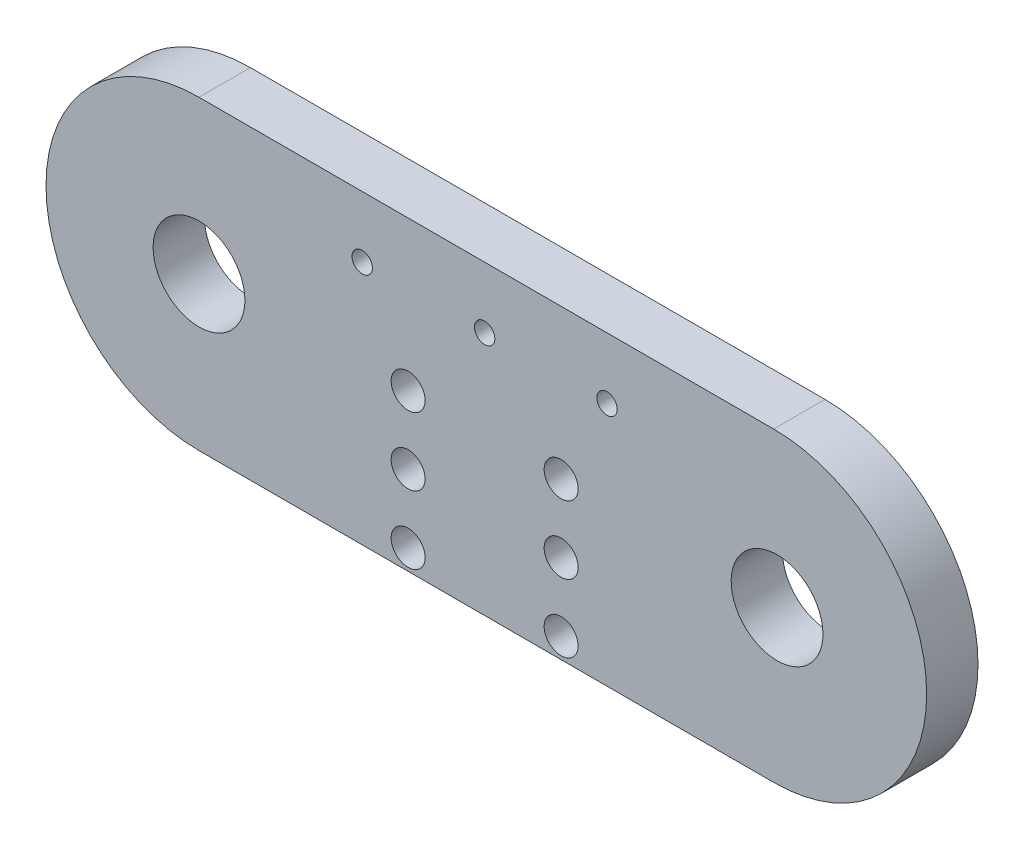
ISO-10303-21;
HEADER;
FILE_DESCRIPTION(('STEP AP214'),'2;1');
FILE_NAME('part.step','',(''),(''),'','','');
FILE_SCHEMA(('AUTOMOTIVE_DESIGN { 1 0 10303 214 1 1 1 1 }'));
ENDSEC;
DATA;
#1=APPLICATION_CONTEXT('core data for automotive mechanical design processes');
#2=APPLICATION_PROTOCOL_DEFINITION('international standard','automotive_design',2000,#1);
#3=PRODUCT_CONTEXT('',#1,'mechanical');
#4=PRODUCT('Part','Part','',(#3));
#5=PRODUCT_RELATED_PRODUCT_CATEGORY('part','',(#4));
#6=PRODUCT_DEFINITION_FORMATION('','',#4);
#7=PRODUCT_DEFINITION_CONTEXT('part definition',#1,'design');
#8=PRODUCT_DEFINITION('design','',#6,#7);
#9=PRODUCT_DEFINITION_SHAPE('','',#8);
#10=(LENGTH_UNIT() NAMED_UNIT(*) SI_UNIT(.MILLI.,.METRE.));
#11=(NAMED_UNIT(*) PLANE_ANGLE_UNIT() SI_UNIT($,.RADIAN.));
#12=(NAMED_UNIT(*) SI_UNIT($,.STERADIAN.) SOLID_ANGLE_UNIT());
#13=UNCERTAINTY_MEASURE_WITH_UNIT(LENGTH_MEASURE(1.E-05),#10,'distance_accuracy_value','');
#14=(GEOMETRIC_REPRESENTATION_CONTEXT(3) GLOBAL_UNCERTAINTY_ASSIGNED_CONTEXT((#13)) GLOBAL_UNIT_ASSIGNED_CONTEXT((#10,
#11,#12)) REPRESENTATION_CONTEXT('',''));
#15=CARTESIAN_POINT('',(0.,0.,0.));
#16=DIRECTION('',(0.,0.,1.));
#17=DIRECTION('',(1.,0.,0.));
#18=AXIS2_PLACEMENT_3D('',#15,#16,#17);
#19=CARTESIAN_POINT('',(48.5,61.,-0.046));
#20=DIRECTION('',(0.,0.,-1.));
#21=DIRECTION('',(0.,-1.,0.));
#22=AXIS2_PLACEMENT_3D('',#19,#20,#21);
#23=CYLINDRICAL_SURFACE('',#22,1.35);
#24=CARTESIAN_POINT('',(48.5,61.,0.));
#25=DIRECTION('',(0.,0.,-1.));
#26=DIRECTION('',(0.,-1.,0.));
#27=AXIS2_PLACEMENT_3D('',#24,#25,#26);
#28=CIRCLE('',#27,1.35);
#29=CARTESIAN_POINT('',(48.5,59.65,0.));
#30=VERTEX_POINT('',#29);
#31=EDGE_CURVE('E237',#30,#30,#28,.T.);
#32=ORIENTED_EDGE('',*,*,#31,.T.);
#33=DIRECTION('',(0.,0.,1.));
#34=VECTOR('',#33,1.);
#35=CARTESIAN_POINT('',(48.5,59.65,-0.046));
#36=LINE('',#35,#34);
#37=CARTESIAN_POINT('',(48.5,59.65,1.51));
#38=VERTEX_POINT('',#37);
#39=EDGE_CURVE('E11',#30,#38,#36,.T.);
#40=ORIENTED_EDGE('',*,*,#39,.T.);
#41=CARTESIAN_POINT('',(48.5,61.,1.51));
#42=DIRECTION('',(0.,0.,-1.));
#43=DIRECTION('',(0.,-1.,0.));
#44=AXIS2_PLACEMENT_3D('',#41,#42,#43);
#45=CIRCLE('',#44,1.35);
#46=EDGE_CURVE('E227',#38,#38,#45,.T.);
#47=ORIENTED_EDGE('',*,*,#46,.F.);
#48=ORIENTED_EDGE('',*,*,#39,.F.);
#49=EDGE_LOOP('',(#32,#40,#47,#48));
#50=FACE_BOUND('',#49,.T.);
#51=ADVANCED_FACE('F44',(#50),#23,.F.);
#52=CARTESIAN_POINT('',(43.5,63.7,-0.046));
#53=DIRECTION('',(0.,0.,-1.));
#54=DIRECTION('',(0.,-1.,0.));
#55=AXIS2_PLACEMENT_3D('',#52,#53,#54);
#56=CYLINDRICAL_SURFACE('',#55,0.3);
#57=CARTESIAN_POINT('',(43.5,63.7,0.));
#58=DIRECTION('',(0.,0.,-1.));
#59=DIRECTION('',(0.,-1.,0.));
#60=AXIS2_PLACEMENT_3D('',#57,#58,#59);
#61=CIRCLE('',#60,0.3);
#62=CARTESIAN_POINT('',(43.5,63.4,0.));
#63=VERTEX_POINT('',#62);
#64=EDGE_CURVE('E256',#63,#63,#61,.T.);
#65=ORIENTED_EDGE('',*,*,#64,.T.);
#66=DIRECTION('',(0.,0.,1.));
#67=VECTOR('',#66,1.);
#68=CARTESIAN_POINT('',(43.5,63.4,-0.046));
#69=LINE('',#68,#67);
#70=CARTESIAN_POINT('',(43.5,63.4,1.51));
#71=VERTEX_POINT('',#70);
#72=EDGE_CURVE('E54',#63,#71,#69,.T.);
#73=ORIENTED_EDGE('',*,*,#72,.T.);
#74=CARTESIAN_POINT('',(43.5,63.7,1.51));
#75=DIRECTION('',(0.,0.,-1.));
#76=DIRECTION('',(0.,-1.,0.));
#77=AXIS2_PLACEMENT_3D('',#74,#75,#76);
#78=CIRCLE('',#77,0.3);
#79=EDGE_CURVE('E202',#71,#71,#78,.T.);
#80=ORIENTED_EDGE('',*,*,#79,.F.);
#81=ORIENTED_EDGE('',*,*,#72,.F.);
#82=EDGE_LOOP('',(#65,#73,#80,#81));
#83=FACE_BOUND('',#82,.T.);
#84=ADVANCED_FACE('F311',(#83),#56,.F.);
#85=CARTESIAN_POINT('',(39.9,63.7,-0.046));
#86=DIRECTION('',(0.,0.,-1.));
#87=DIRECTION('',(0.,-1.,0.));
#88=AXIS2_PLACEMENT_3D('',#85,#86,#87);
#89=CYLINDRICAL_SURFACE('',#88,0.3);
#90=CARTESIAN_POINT('',(39.9,63.7,0.));
#91=DIRECTION('',(0.,0.,-1.));
#92=DIRECTION('',(0.,-1.,0.));
#93=AXIS2_PLACEMENT_3D('',#90,#91,#92);
#94=CIRCLE('',#93,0.3);
#95=CARTESIAN_POINT('',(39.9,63.4,0.));
#96=VERTEX_POINT('',#95);
#97=EDGE_CURVE('E259',#96,#96,#94,.T.);
#98=ORIENTED_EDGE('',*,*,#97,.T.);
#99=DIRECTION('',(0.,0.,1.));
#100=VECTOR('',#99,1.);
#101=CARTESIAN_POINT('',(39.9,63.4,-0.046));
#102=LINE('',#101,#100);
#103=CARTESIAN_POINT('',(39.9,63.4,1.51));
#104=VERTEX_POINT('',#103);
#105=EDGE_CURVE('E196',#96,#104,#102,.T.);
#106=ORIENTED_EDGE('',*,*,#105,.T.);
#107=CARTESIAN_POINT('',(39.9,63.7,1.51));
#108=DIRECTION('',(0.,0.,-1.));
#109=DIRECTION('',(0.,-1.,0.));
#110=AXIS2_PLACEMENT_3D('',#107,#108,#109);
#111=CIRCLE('',#110,0.3);
#112=EDGE_CURVE('E199',#104,#104,#111,.T.);
#113=ORIENTED_EDGE('',*,*,#112,.F.);
#114=ORIENTED_EDGE('',*,*,#105,.F.);
#115=EDGE_LOOP('',(#98,#106,#113,#114));
#116=FACE_BOUND('',#115,.T.);
#117=ADVANCED_FACE('F316',(#116),#89,.F.);
#118=CARTESIAN_POINT('',(42.15,61.1,-0.046));
#119=DIRECTION('',(0.,0.,-1.));
#120=DIRECTION('',(0.,-1.,0.));
#121=AXIS2_PLACEMENT_3D('',#118,#119,#120);
#122=CYLINDRICAL_SURFACE('',#121,0.5);
#123=CARTESIAN_POINT('',(42.15,61.1,0.));
#124=DIRECTION('',(0.,0.,-1.));
#125=DIRECTION('',(0.,-1.,0.));
#126=AXIS2_PLACEMENT_3D('',#123,#124,#125);
#127=CIRCLE('',#126,0.5);
#128=CARTESIAN_POINT('',(42.15,60.6,0.));
#129=VERTEX_POINT('',#128);
#130=EDGE_CURVE('E262',#129,#129,#127,.T.);
#131=ORIENTED_EDGE('',*,*,#130,.T.);
#132=DIRECTION('',(0.,0.,1.));
#133=VECTOR('',#132,1.);
#134=CARTESIAN_POINT('',(42.15,60.6,-0.046));
#135=LINE('',#134,#133);
#136=CARTESIAN_POINT('',(42.15,60.6,1.51));
#137=VERTEX_POINT('',#136);
#138=EDGE_CURVE('E207',#129,#137,#135,.T.);
#139=ORIENTED_EDGE('',*,*,#138,.T.);
#140=CARTESIAN_POINT('',(42.15,61.1,1.51));
#141=DIRECTION('',(0.,0.,-1.));
#142=DIRECTION('',(0.,-1.,0.));
#143=AXIS2_PLACEMENT_3D('',#140,#141,#142);
#144=CIRCLE('',#143,0.5);
#145=EDGE_CURVE('E203',#137,#137,#144,.T.);
#146=ORIENTED_EDGE('',*,*,#145,.F.);
#147=ORIENTED_EDGE('',*,*,#138,.F.);
#148=EDGE_LOOP('',(#131,#139,#146,#147));
#149=FACE_BOUND('',#148,.T.);
#150=ADVANCED_FACE('F388',(#149),#122,.F.);
#151=CARTESIAN_POINT('',(36.3,63.7,-0.046));
#152=DIRECTION('',(0.,0.,-1.));
#153=DIRECTION('',(0.,-1.,0.));
#154=AXIS2_PLACEMENT_3D('',#151,#152,#153);
#155=CYLINDRICAL_SURFACE('',#154,0.3);
#156=CARTESIAN_POINT('',(36.3,63.7,0.));
#157=DIRECTION('',(0.,0.,-1.));
#158=DIRECTION('',(0.,-1.,0.));
#159=AXIS2_PLACEMENT_3D('',#156,#157,#158);
#160=CIRCLE('',#159,0.3);
#161=CARTESIAN_POINT('',(36.3,63.4,0.));
#162=VERTEX_POINT('',#161);
#163=EDGE_CURVE('E252',#162,#162,#160,.T.);
#164=ORIENTED_EDGE('',*,*,#163,.T.);
#165=DIRECTION('',(0.,0.,1.));
#166=VECTOR('',#165,1.);
#167=CARTESIAN_POINT('',(36.3,63.4,-0.046));
#168=LINE('',#167,#166);
#169=CARTESIAN_POINT('',(36.3,63.4,1.51));
#170=VERTEX_POINT('',#169);
#171=EDGE_CURVE('E198',#162,#170,#168,.T.);
#172=ORIENTED_EDGE('',*,*,#171,.T.);
#173=CARTESIAN_POINT('',(36.3,63.7,1.51));
#174=DIRECTION('',(0.,0.,-1.));
#175=DIRECTION('',(0.,-1.,0.));
#176=AXIS2_PLACEMENT_3D('',#173,#174,#175);
#177=CIRCLE('',#176,0.3);
#178=EDGE_CURVE('E217',#170,#170,#177,.T.);
#179=ORIENTED_EDGE('',*,*,#178,.F.);
#180=ORIENTED_EDGE('',*,*,#171,.F.);
#181=EDGE_LOOP('',(#164,#172,#179,#180));
#182=FACE_BOUND('',#181,.T.);
#183=ADVANCED_FACE('F381',(#182),#155,.F.);
#184=CARTESIAN_POINT('',(37.65,61.1,-0.046));
#185=DIRECTION('',(0.,0.,-1.));
#186=DIRECTION('',(0.,-1.,0.));
#187=AXIS2_PLACEMENT_3D('',#184,#185,#186);
#188=CYLINDRICAL_SURFACE('',#187,0.5);
#189=CARTESIAN_POINT('',(37.65,61.1,0.));
#190=DIRECTION('',(0.,0.,-1.));
#191=DIRECTION('',(0.,-1.,0.));
#192=AXIS2_PLACEMENT_3D('',#189,#190,#191);
#193=CIRCLE('',#192,0.5);
#194=CARTESIAN_POINT('',(37.65,60.6,0.));
#195=VERTEX_POINT('',#194);
#196=EDGE_CURVE('E210',#195,#195,#193,.T.);
#197=ORIENTED_EDGE('',*,*,#196,.T.);
#198=DIRECTION('',(0.,0.,1.));
#199=VECTOR('',#198,1.);
#200=CARTESIAN_POINT('',(37.65,60.6,-0.046));
#201=LINE('',#200,#199);
#202=CARTESIAN_POINT('',(37.65,60.6,1.51));
#203=VERTEX_POINT('',#202);
#204=EDGE_CURVE('E147',#195,#203,#201,.T.);
#205=ORIENTED_EDGE('',*,*,#204,.T.);
#206=CARTESIAN_POINT('',(37.65,61.1,1.51));
#207=DIRECTION('',(0.,0.,-1.));
#208=DIRECTION('',(0.,-1.,0.));
#209=AXIS2_PLACEMENT_3D('',#206,#207,#208);
#210=CIRCLE('',#209,0.5);
#211=EDGE_CURVE('E187',#203,#203,#210,.T.);
#212=ORIENTED_EDGE('',*,*,#211,.F.);
#213=ORIENTED_EDGE('',*,*,#204,.F.);
#214=EDGE_LOOP('',(#197,#205,#212,#213));
#215=FACE_BOUND('',#214,.T.);
#216=ADVANCED_FACE('F346',(#215),#188,.F.);
#217=CARTESIAN_POINT('',(42.15,59.1,-0.046));
#218=DIRECTION('',(0.,0.,-1.));
#219=DIRECTION('',(0.,-1.,0.));
#220=AXIS2_PLACEMENT_3D('',#217,#218,#219);
#221=CYLINDRICAL_SURFACE('',#220,0.5);
#222=CARTESIAN_POINT('',(42.15,59.1,0.));
#223=DIRECTION('',(0.,0.,-1.));
#224=DIRECTION('',(0.,-1.,0.));
#225=AXIS2_PLACEMENT_3D('',#222,#223,#224);
#226=CIRCLE('',#225,0.5);
#227=CARTESIAN_POINT('',(42.15,58.6,0.));
#228=VERTEX_POINT('',#227);
#229=EDGE_CURVE('E205',#228,#228,#226,.T.);
#230=ORIENTED_EDGE('',*,*,#229,.T.);
#231=DIRECTION('',(0.,0.,1.));
#232=VECTOR('',#231,1.);
#233=CARTESIAN_POINT('',(42.15,58.6,-0.046));
#234=LINE('',#233,#232);
#235=CARTESIAN_POINT('',(42.15,58.6,1.51));
#236=VERTEX_POINT('',#235);
#237=EDGE_CURVE('E157',#228,#236,#234,.T.);
#238=ORIENTED_EDGE('',*,*,#237,.T.);
#239=CARTESIAN_POINT('',(42.15,59.1,1.51));
#240=DIRECTION('',(0.,0.,-1.));
#241=DIRECTION('',(0.,-1.,0.));
#242=AXIS2_PLACEMENT_3D('',#239,#240,#241);
#243=CIRCLE('',#242,0.5);
#244=EDGE_CURVE('E224',#236,#236,#243,.T.);
#245=ORIENTED_EDGE('',*,*,#244,.F.);
#246=ORIENTED_EDGE('',*,*,#237,.F.);
#247=EDGE_LOOP('',(#230,#238,#245,#246));
#248=FACE_BOUND('',#247,.T.);
#249=ADVANCED_FACE('F343',(#248),#221,.F.);
#250=CARTESIAN_POINT('',(37.65,59.1,-0.046));
#251=DIRECTION('',(0.,0.,-1.));
#252=DIRECTION('',(0.,-1.,0.));
#253=AXIS2_PLACEMENT_3D('',#250,#251,#252);
#254=CYLINDRICAL_SURFACE('',#253,0.5);
#255=CARTESIAN_POINT('',(37.65,59.1,0.));
#256=DIRECTION('',(0.,0.,-1.));
#257=DIRECTION('',(0.,-1.,0.));
#258=AXIS2_PLACEMENT_3D('',#255,#256,#257);
#259=CIRCLE('',#258,0.5);
#260=CARTESIAN_POINT('',(37.65,58.6,0.));
#261=VERTEX_POINT('',#260);
#262=EDGE_CURVE('E178',#261,#261,#259,.T.);
#263=ORIENTED_EDGE('',*,*,#262,.T.);
#264=DIRECTION('',(0.,0.,1.));
#265=VECTOR('',#264,1.);
#266=CARTESIAN_POINT('',(37.65,58.6,-0.046));
#267=LINE('',#266,#265);
#268=CARTESIAN_POINT('',(37.65,58.6,1.51));
#269=VERTEX_POINT('',#268);
#270=EDGE_CURVE('E175',#261,#269,#267,.T.);
#271=ORIENTED_EDGE('',*,*,#270,.T.);
#272=CARTESIAN_POINT('',(37.65,59.1,1.51));
#273=DIRECTION('',(0.,0.,-1.));
#274=DIRECTION('',(0.,-1.,0.));
#275=AXIS2_PLACEMENT_3D('',#272,#273,#274);
#276=CIRCLE('',#275,0.5);
#277=EDGE_CURVE('E180',#269,#269,#276,.T.);
#278=ORIENTED_EDGE('',*,*,#277,.F.);
#279=ORIENTED_EDGE('',*,*,#270,.F.);
#280=EDGE_LOOP('',(#263,#271,#278,#279));
#281=FACE_BOUND('',#280,.T.);
#282=ADVANCED_FACE('F176',(#281),#254,.F.);
#283=CARTESIAN_POINT('',(31.5,61.,-0.046));
#284=DIRECTION('',(0.,0.,-1.));
#285=DIRECTION('',(0.,-1.,0.));
#286=AXIS2_PLACEMENT_3D('',#283,#284,#285);
#287=CYLINDRICAL_SURFACE('',#286,1.35);
#288=CARTESIAN_POINT('',(31.5,61.,0.));
#289=DIRECTION('',(0.,0.,-1.));
#290=DIRECTION('',(0.,-1.,0.));
#291=AXIS2_PLACEMENT_3D('',#288,#289,#290);
#292=CIRCLE('',#291,1.35);
#293=CARTESIAN_POINT('',(31.5,59.65,0.));
#294=VERTEX_POINT('',#293);
#295=EDGE_CURVE('E206',#294,#294,#292,.T.);
#296=ORIENTED_EDGE('',*,*,#295,.T.);
#297=DIRECTION('',(0.,0.,1.));
#298=VECTOR('',#297,1.);
#299=CARTESIAN_POINT('',(31.5,59.65,-0.046));
#300=LINE('',#299,#298);
#301=CARTESIAN_POINT('',(31.5,59.65,1.51));
#302=VERTEX_POINT('',#301);
#303=EDGE_CURVE('E181',#294,#302,#300,.T.);
#304=ORIENTED_EDGE('',*,*,#303,.T.);
#305=CARTESIAN_POINT('',(31.5,61.,1.51));
#306=DIRECTION('',(0.,0.,-1.));
#307=DIRECTION('',(0.,-1.,0.));
#308=AXIS2_PLACEMENT_3D('',#305,#306,#307);
#309=CIRCLE('',#308,1.35);
#310=EDGE_CURVE('E225',#302,#302,#309,.T.);
#311=ORIENTED_EDGE('',*,*,#310,.F.);
#312=ORIENTED_EDGE('',*,*,#303,.F.);
#313=EDGE_LOOP('',(#296,#304,#311,#312));
#314=FACE_BOUND('',#313,.T.);
#315=ADVANCED_FACE('F279',(#314),#287,.F.);
#316=CARTESIAN_POINT('',(42.15,57.1,-0.046));
#317=DIRECTION('',(0.,0.,-1.));
#318=DIRECTION('',(0.,-1.,0.));
#319=AXIS2_PLACEMENT_3D('',#316,#317,#318);
#320=CYLINDRICAL_SURFACE('',#319,0.5);
#321=CARTESIAN_POINT('',(42.15,57.1,0.));
#322=DIRECTION('',(0.,0.,-1.));
#323=DIRECTION('',(0.,-1.,0.));
#324=AXIS2_PLACEMENT_3D('',#321,#322,#323);
#325=CIRCLE('',#324,0.5);
#326=CARTESIAN_POINT('',(42.15,56.6,0.));
#327=VERTEX_POINT('',#326);
#328=EDGE_CURVE('E213',#327,#327,#325,.T.);
#329=ORIENTED_EDGE('',*,*,#328,.T.);
#330=DIRECTION('',(0.,0.,1.));
#331=VECTOR('',#330,1.);
#332=CARTESIAN_POINT('',(42.15,56.6,-0.046));
#333=LINE('',#332,#331);
#334=CARTESIAN_POINT('',(42.15,56.6,1.51));
#335=VERTEX_POINT('',#334);
#336=EDGE_CURVE('E136',#327,#335,#333,.T.);
#337=ORIENTED_EDGE('',*,*,#336,.T.);
#338=CARTESIAN_POINT('',(42.15,57.1,1.51));
#339=DIRECTION('',(0.,0.,-1.));
#340=DIRECTION('',(0.,-1.,0.));
#341=AXIS2_PLACEMENT_3D('',#338,#339,#340);
#342=CIRCLE('',#341,0.5);
#343=EDGE_CURVE('E231',#335,#335,#342,.T.);
#344=ORIENTED_EDGE('',*,*,#343,.F.);
#345=ORIENTED_EDGE('',*,*,#336,.F.);
#346=EDGE_LOOP('',(#329,#337,#344,#345));
#347=FACE_BOUND('',#346,.T.);
#348=ADVANCED_FACE('F307',(#347),#320,.F.);
#349=CARTESIAN_POINT('',(37.65,57.1,-0.046));
#350=DIRECTION('',(0.,0.,-1.));
#351=DIRECTION('',(0.,-1.,0.));
#352=AXIS2_PLACEMENT_3D('',#349,#350,#351);
#353=CYLINDRICAL_SURFACE('',#352,0.5);
#354=CARTESIAN_POINT('',(37.65,57.1,0.));
#355=DIRECTION('',(0.,0.,-1.));
#356=DIRECTION('',(0.,-1.,0.));
#357=AXIS2_PLACEMENT_3D('',#354,#355,#356);
#358=CIRCLE('',#357,0.5);
#359=CARTESIAN_POINT('',(37.65,56.6,0.));
#360=VERTEX_POINT('',#359);
#361=EDGE_CURVE('E211',#360,#360,#358,.T.);
#362=ORIENTED_EDGE('',*,*,#361,.T.);
#363=DIRECTION('',(0.,0.,1.));
#364=VECTOR('',#363,1.);
#365=CARTESIAN_POINT('',(37.65,56.6,-0.046));
#366=LINE('',#365,#364);
#367=CARTESIAN_POINT('',(37.65,56.6,1.51));
#368=VERTEX_POINT('',#367);
#369=EDGE_CURVE('E129',#360,#368,#366,.T.);
#370=ORIENTED_EDGE('',*,*,#369,.T.);
#371=CARTESIAN_POINT('',(37.65,57.1,1.51));
#372=DIRECTION('',(0.,0.,-1.));
#373=DIRECTION('',(0.,-1.,0.));
#374=AXIS2_PLACEMENT_3D('',#371,#372,#373);
#375=CIRCLE('',#374,0.5);
#376=EDGE_CURVE('E191',#368,#368,#375,.T.);
#377=ORIENTED_EDGE('',*,*,#376,.F.);
#378=ORIENTED_EDGE('',*,*,#369,.F.);
#379=EDGE_LOOP('',(#362,#370,#377,#378));
#380=FACE_BOUND('',#379,.T.);
#381=ADVANCED_FACE('F300',(#380),#353,.F.);
#382=CARTESIAN_POINT('',(31.5,61.,0.));
#383=DIRECTION('',(0.,0.,-1.));
#384=DIRECTION('',(0.,-1.,0.));
#385=AXIS2_PLACEMENT_3D('',#382,#383,#384);
#386=CYLINDRICAL_SURFACE('',#385,4.5);
#387=DIRECTION('',(0.,0.,1.));
#388=VECTOR('',#387,1.);
#389=CARTESIAN_POINT('',(31.5,56.5,0.));
#390=LINE('',#389,#388);
#391=CARTESIAN_POINT('',(31.5,56.5,0.));
#392=VERTEX_POINT('',#391);
#393=CARTESIAN_POINT('',(31.5,56.5,1.51));
#394=VERTEX_POINT('',#393);
#395=EDGE_CURVE('E194',#392,#394,#390,.T.);
#396=ORIENTED_EDGE('',*,*,#395,.T.);
#397=CARTESIAN_POINT('',(31.5,61.,1.51));
#398=DIRECTION('',(0.,0.,-1.));
#399=DIRECTION('',(0.,-1.,0.));
#400=AXIS2_PLACEMENT_3D('',#397,#398,#399);
#401=CIRCLE('',#400,4.5);
#402=CARTESIAN_POINT('',(31.5,65.5,1.51));
#403=VERTEX_POINT('',#402);
#404=EDGE_CURVE('E189',#394,#403,#401,.T.);
#405=ORIENTED_EDGE('',*,*,#404,.T.);
#406=DIRECTION('',(0.,0.,1.));
#407=VECTOR('',#406,1.);
#408=CARTESIAN_POINT('',(31.5,65.5,0.));
#409=LINE('',#408,#407);
#410=CARTESIAN_POINT('',(31.5,65.5,0.));
#411=VERTEX_POINT('',#410);
#412=EDGE_CURVE('E121',#411,#403,#409,.T.);
#413=ORIENTED_EDGE('',*,*,#412,.F.);
#414=CARTESIAN_POINT('',(31.5,61.,0.));
#415=DIRECTION('',(0.,0.,-1.));
#416=DIRECTION('',(0.,-1.,0.));
#417=AXIS2_PLACEMENT_3D('',#414,#415,#416);
#418=CIRCLE('',#417,4.5);
#419=EDGE_CURVE('E241',#392,#411,#418,.T.);
#420=ORIENTED_EDGE('',*,*,#419,.F.);
#421=EDGE_LOOP('',(#396,#405,#413,#420));
#422=FACE_BOUND('',#421,.T.);
#423=ADVANCED_FACE('F297',(#422),#386,.T.);
#424=CARTESIAN_POINT('',(31.5,65.5,0.));
#425=DIRECTION('',(0.,1.,0.));
#426=DIRECTION('',(1.,0.,0.));
#427=AXIS2_PLACEMENT_3D('',#424,#425,#426);
#428=PLANE('',#427);
#429=ORIENTED_EDGE('',*,*,#412,.T.);
#430=DIRECTION('',(1.,0.,0.));
#431=VECTOR('',#430,1.);
#432=CARTESIAN_POINT('',(31.5,65.5,1.51));
#433=LINE('',#432,#431);
#434=CARTESIAN_POINT('',(48.4,65.5,1.51));
#435=VERTEX_POINT('',#434);
#436=EDGE_CURVE('E192',#403,#435,#433,.T.);
#437=ORIENTED_EDGE('',*,*,#436,.T.);
#438=DIRECTION('',(0.,0.,1.));
#439=VECTOR('',#438,1.);
#440=CARTESIAN_POINT('',(48.4,65.5,0.));
#441=LINE('',#440,#439);
#442=CARTESIAN_POINT('',(48.4,65.5,0.));
#443=VERTEX_POINT('',#442);
#444=EDGE_CURVE('E112',#443,#435,#441,.T.);
#445=ORIENTED_EDGE('',*,*,#444,.F.);
#446=DIRECTION('',(1.,0.,0.));
#447=VECTOR('',#446,1.);
#448=CARTESIAN_POINT('',(31.5,65.5,0.));
#449=LINE('',#448,#447);
#450=EDGE_CURVE('E220',#411,#443,#449,.T.);
#451=ORIENTED_EDGE('',*,*,#450,.F.);
#452=EDGE_LOOP('',(#429,#437,#445,#451));
#453=FACE_BOUND('',#452,.T.);
#454=ADVANCED_FACE('F299',(#453),#428,.T.);
#455=CARTESIAN_POINT('',(48.4,61.,0.));
#456=DIRECTION('',(0.,0.,-1.));
#457=DIRECTION('',(0.,1.,0.));
#458=AXIS2_PLACEMENT_3D('',#455,#456,#457);
#459=CYLINDRICAL_SURFACE('',#458,4.5);
#460=ORIENTED_EDGE('',*,*,#444,.T.);
#461=CARTESIAN_POINT('',(48.4,61.,1.51));
#462=DIRECTION('',(0.,0.,-1.));
#463=DIRECTION('',(0.,1.,0.));
#464=AXIS2_PLACEMENT_3D('',#461,#462,#463);
#465=CIRCLE('',#464,4.5);
#466=CARTESIAN_POINT('',(48.4,56.5,1.51));
#467=VERTEX_POINT('',#466);
#468=EDGE_CURVE('E236',#435,#467,#465,.T.);
#469=ORIENTED_EDGE('',*,*,#468,.T.);
#470=DIRECTION('',(0.,0.,1.));
#471=VECTOR('',#470,1.);
#472=CARTESIAN_POINT('',(48.4,56.5,0.));
#473=LINE('',#472,#471);
#474=CARTESIAN_POINT('',(48.4,56.5,0.));
#475=VERTEX_POINT('',#474);
#476=EDGE_CURVE('E228',#475,#467,#473,.T.);
#477=ORIENTED_EDGE('',*,*,#476,.F.);
#478=CARTESIAN_POINT('',(48.4,61.,0.));
#479=DIRECTION('',(0.,0.,-1.));
#480=DIRECTION('',(0.,1.,0.));
#481=AXIS2_PLACEMENT_3D('',#478,#479,#480);
#482=CIRCLE('',#481,4.5);
#483=EDGE_CURVE('E214',#443,#475,#482,.T.);
#484=ORIENTED_EDGE('',*,*,#483,.F.);
#485=EDGE_LOOP('',(#460,#469,#477,#484));
#486=FACE_BOUND('',#485,.T.);
#487=ADVANCED_FACE('F291',(#486),#459,.T.);
#488=CARTESIAN_POINT('',(48.4,56.5,0.));
#489=DIRECTION('',(0.,-1.,0.));
#490=DIRECTION('',(0.,0.,-1.));
#491=AXIS2_PLACEMENT_3D('',#488,#489,#490);
#492=PLANE('',#491);
#493=ORIENTED_EDGE('',*,*,#476,.T.);
#494=DIRECTION('',(-1.,0.,0.));
#495=VECTOR('',#494,1.);
#496=CARTESIAN_POINT('',(48.4,56.5,1.51));
#497=LINE('',#496,#495);
#498=EDGE_CURVE('E234',#467,#394,#497,.T.);
#499=ORIENTED_EDGE('',*,*,#498,.T.);
#500=ORIENTED_EDGE('',*,*,#395,.F.);
#501=DIRECTION('',(-1.,0.,0.));
#502=VECTOR('',#501,1.);
#503=CARTESIAN_POINT('',(35.8,56.5,0.));
#504=LINE('',#503,#502);
#505=EDGE_CURVE('E239',#475,#392,#504,.T.);
#506=ORIENTED_EDGE('',*,*,#505,.F.);
#507=EDGE_LOOP('',(#493,#499,#500,#506));
#508=FACE_BOUND('',#507,.T.);
#509=ADVANCED_FACE('F295',(#508),#492,.T.);
#510=CARTESIAN_POINT('',(0.,0.,1.51));
#511=DIRECTION('',(0.,0.,1.));
#512=DIRECTION('',(1.,0.,0.));
#513=AXIS2_PLACEMENT_3D('',#510,#511,#512);
#514=PLANE('',#513);
#515=ORIENTED_EDGE('',*,*,#404,.F.);
#516=ORIENTED_EDGE('',*,*,#498,.F.);
#517=ORIENTED_EDGE('',*,*,#468,.F.);
#518=ORIENTED_EDGE('',*,*,#436,.F.);
#519=EDGE_LOOP('',(#515,#516,#517,#518));
#520=FACE_BOUND('',#519,.T.);
#521=ORIENTED_EDGE('',*,*,#46,.T.);
#522=EDGE_LOOP('',(#521));
#523=FACE_BOUND('',#522,.T.);
#524=ORIENTED_EDGE('',*,*,#79,.T.);
#525=EDGE_LOOP('',(#524));
#526=FACE_BOUND('',#525,.T.);
#527=ORIENTED_EDGE('',*,*,#112,.T.);
#528=EDGE_LOOP('',(#527));
#529=FACE_BOUND('',#528,.T.);
#530=ORIENTED_EDGE('',*,*,#145,.T.);
#531=EDGE_LOOP('',(#530));
#532=FACE_BOUND('',#531,.T.);
#533=ORIENTED_EDGE('',*,*,#178,.T.);
#534=EDGE_LOOP('',(#533));
#535=FACE_BOUND('',#534,.T.);
#536=ORIENTED_EDGE('',*,*,#211,.T.);
#537=EDGE_LOOP('',(#536));
#538=FACE_BOUND('',#537,.T.);
#539=ORIENTED_EDGE('',*,*,#244,.T.);
#540=EDGE_LOOP('',(#539));
#541=FACE_BOUND('',#540,.T.);
#542=ORIENTED_EDGE('',*,*,#277,.T.);
#543=EDGE_LOOP('',(#542));
#544=FACE_BOUND('',#543,.T.);
#545=ORIENTED_EDGE('',*,*,#310,.T.);
#546=EDGE_LOOP('',(#545));
#547=FACE_BOUND('',#546,.T.);
#548=ORIENTED_EDGE('',*,*,#343,.T.);
#549=EDGE_LOOP('',(#548));
#550=FACE_BOUND('',#549,.T.);
#551=ORIENTED_EDGE('',*,*,#376,.T.);
#552=EDGE_LOOP('',(#551));
#553=FACE_BOUND('',#552,.T.);
#554=ADVANCED_FACE('F284',(#520,#523,#526,#529,#532,#535,#538,#541,#544,#547,#550,#553),#514,.T.);
#555=CARTESIAN_POINT('',(0.,0.,0.));
#556=DIRECTION('',(0.,0.,1.));
#557=DIRECTION('',(1.,0.,0.));
#558=AXIS2_PLACEMENT_3D('',#555,#556,#557);
#559=PLANE('',#558);
#560=ORIENTED_EDGE('',*,*,#31,.F.);
#561=EDGE_LOOP('',(#560));
#562=FACE_BOUND('',#561,.T.);
#563=ORIENTED_EDGE('',*,*,#64,.F.);
#564=EDGE_LOOP('',(#563));
#565=FACE_BOUND('',#564,.T.);
#566=ORIENTED_EDGE('',*,*,#97,.F.);
#567=EDGE_LOOP('',(#566));
#568=FACE_BOUND('',#567,.T.);
#569=ORIENTED_EDGE('',*,*,#130,.F.);
#570=EDGE_LOOP('',(#569));
#571=FACE_BOUND('',#570,.T.);
#572=ORIENTED_EDGE('',*,*,#163,.F.);
#573=EDGE_LOOP('',(#572));
#574=FACE_BOUND('',#573,.T.);
#575=ORIENTED_EDGE('',*,*,#196,.F.);
#576=EDGE_LOOP('',(#575));
#577=FACE_BOUND('',#576,.T.);
#578=ORIENTED_EDGE('',*,*,#229,.F.);
#579=EDGE_LOOP('',(#578));
#580=FACE_BOUND('',#579,.T.);
#581=ORIENTED_EDGE('',*,*,#262,.F.);
#582=EDGE_LOOP('',(#581));
#583=FACE_BOUND('',#582,.T.);
#584=ORIENTED_EDGE('',*,*,#295,.F.);
#585=EDGE_LOOP('',(#584));
#586=FACE_BOUND('',#585,.T.);
#587=ORIENTED_EDGE('',*,*,#328,.F.);
#588=EDGE_LOOP('',(#587));
#589=FACE_BOUND('',#588,.T.);
#590=ORIENTED_EDGE('',*,*,#361,.F.);
#591=EDGE_LOOP('',(#590));
#592=FACE_BOUND('',#591,.T.);
#593=ORIENTED_EDGE('',*,*,#483,.T.);
#594=ORIENTED_EDGE('',*,*,#505,.T.);
#595=ORIENTED_EDGE('',*,*,#419,.T.);
#596=ORIENTED_EDGE('',*,*,#450,.T.);
#597=EDGE_LOOP('',(#593,#594,#595,#596));
#598=FACE_BOUND('',#597,.T.);
#599=ADVANCED_FACE('F46',(#562,#565,#568,#571,#574,#577,#580,#583,#586,#589,#592,#598),#559,.F.);
#600=CLOSED_SHELL('',(#51,#84,#117,#150,#183,#216,#249,#282,#315,#348,#381,#423,#454,#487,#509,
#554,#599));
#601=MANIFOLD_SOLID_BREP('B2',#600);
#602=ADVANCED_BREP_SHAPE_REPRESENTATION('',(#18,#601),#14);
#603=SHAPE_DEFINITION_REPRESENTATION(#9,#602);
ENDSEC;
END-ISO-10303-21;
